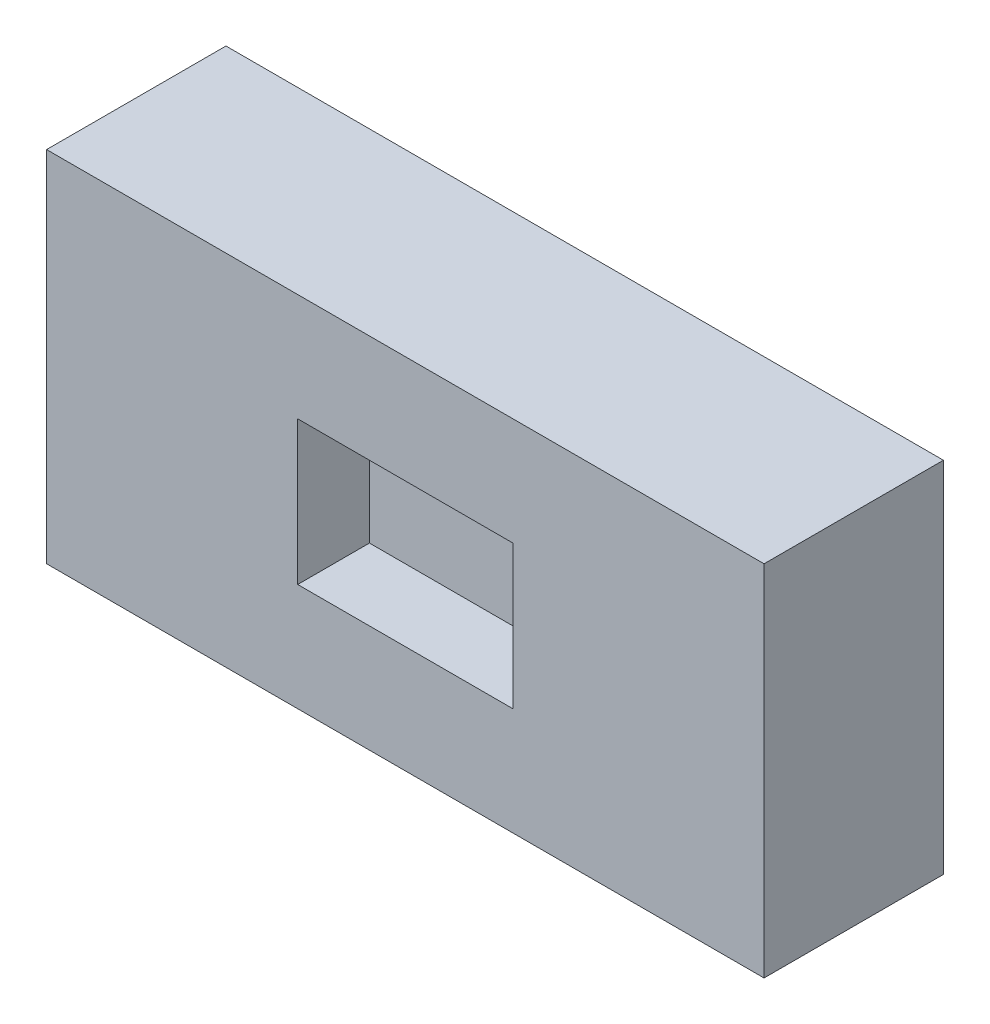
ISO-10303-21;
HEADER;
FILE_DESCRIPTION(('STEP AP214'),'2;1');
FILE_NAME('part.step','',(''),(''),'','','');
FILE_SCHEMA(('AUTOMOTIVE_DESIGN { 1 0 10303 214 1 1 1 1 }'));
ENDSEC;
DATA;
#1=APPLICATION_CONTEXT('core data for automotive mechanical design processes');
#2=APPLICATION_PROTOCOL_DEFINITION('international standard','automotive_design',2000,#1);
#3=PRODUCT_CONTEXT('',#1,'mechanical');
#4=PRODUCT('Part','Part','',(#3));
#5=PRODUCT_RELATED_PRODUCT_CATEGORY('part','',(#4));
#6=PRODUCT_DEFINITION_FORMATION('','',#4);
#7=PRODUCT_DEFINITION_CONTEXT('part definition',#1,'design');
#8=PRODUCT_DEFINITION('design','',#6,#7);
#9=PRODUCT_DEFINITION_SHAPE('','',#8);
#10=(LENGTH_UNIT() NAMED_UNIT(*) SI_UNIT(.MILLI.,.METRE.));
#11=(NAMED_UNIT(*) PLANE_ANGLE_UNIT() SI_UNIT($,.RADIAN.));
#12=(NAMED_UNIT(*) SI_UNIT($,.STERADIAN.) SOLID_ANGLE_UNIT());
#13=UNCERTAINTY_MEASURE_WITH_UNIT(LENGTH_MEASURE(1.E-05),#10,'distance_accuracy_value','');
#14=(GEOMETRIC_REPRESENTATION_CONTEXT(3) GLOBAL_UNCERTAINTY_ASSIGNED_CONTEXT((#13)) GLOBAL_UNIT_ASSIGNED_CONTEXT((#10,
#11,#12)) REPRESENTATION_CONTEXT('',''));
#15=CARTESIAN_POINT('',(0.,0.,0.));
#16=DIRECTION('',(0.,0.,1.));
#17=DIRECTION('',(1.,0.,0.));
#18=AXIS2_PLACEMENT_3D('',#15,#16,#17);
#19=CARTESIAN_POINT('',(0.,0.,10.));
#20=DIRECTION('',(1.,0.,0.));
#21=DIRECTION('',(0.,0.,-1.));
#22=AXIS2_PLACEMENT_3D('',#19,#20,#21);
#23=PLANE('',#22);
#24=DIRECTION('',(0.,-1.,0.));
#25=VECTOR('',#24,1.);
#26=CARTESIAN_POINT('',(0.,0.,0.));
#27=LINE('',#26,#25);
#28=CARTESIAN_POINT('',(0.,20.,0.));
#29=VERTEX_POINT('',#28);
#30=CARTESIAN_POINT('',(0.,0.,0.));
#31=VERTEX_POINT('',#30);
#32=EDGE_CURVE('E153',#29,#31,#27,.T.);
#33=ORIENTED_EDGE('',*,*,#32,.T.);
#34=DIRECTION('',(0.,0.,-1.));
#35=VECTOR('',#34,1.);
#36=CARTESIAN_POINT('',(0.,0.,10.));
#37=LINE('',#36,#35);
#38=CARTESIAN_POINT('',(0.,0.,10.));
#39=VERTEX_POINT('',#38);
#40=EDGE_CURVE('E11',#39,#31,#37,.T.);
#41=ORIENTED_EDGE('',*,*,#40,.F.);
#42=DIRECTION('',(0.,-1.,0.));
#43=VECTOR('',#42,1.);
#44=CARTESIAN_POINT('',(0.,0.,10.));
#45=LINE('',#44,#43);
#46=CARTESIAN_POINT('',(0.,20.,10.));
#47=VERTEX_POINT('',#46);
#48=EDGE_CURVE('E160',#47,#39,#45,.T.);
#49=ORIENTED_EDGE('',*,*,#48,.F.);
#50=DIRECTION('',(0.,0.,-1.));
#51=VECTOR('',#50,1.);
#52=CARTESIAN_POINT('',(0.,20.,10.));
#53=LINE('',#52,#51);
#54=EDGE_CURVE('E162',#47,#29,#53,.T.);
#55=ORIENTED_EDGE('',*,*,#54,.T.);
#56=EDGE_LOOP('',(#33,#41,#49,#55));
#57=FACE_BOUND('',#56,.T.);
#58=ADVANCED_FACE('F44',(#57),#23,.F.);
#59=CARTESIAN_POINT('',(0.,0.,10.));
#60=DIRECTION('',(0.,1.,0.));
#61=DIRECTION('',(0.,0.,1.));
#62=AXIS2_PLACEMENT_3D('',#59,#60,#61);
#63=PLANE('',#62);
#64=DIRECTION('',(1.,0.,0.));
#65=VECTOR('',#64,1.);
#66=CARTESIAN_POINT('',(0.,0.,0.));
#67=LINE('',#66,#65);
#68=CARTESIAN_POINT('',(40.,0.,0.));
#69=VERTEX_POINT('',#68);
#70=EDGE_CURVE('E167',#31,#69,#67,.T.);
#71=ORIENTED_EDGE('',*,*,#70,.T.);
#72=DIRECTION('',(0.,0.,-1.));
#73=VECTOR('',#72,1.);
#74=CARTESIAN_POINT('',(40.,0.,10.));
#75=LINE('',#74,#73);
#76=CARTESIAN_POINT('',(40.,0.,10.));
#77=VERTEX_POINT('',#76);
#78=EDGE_CURVE('E55',#77,#69,#75,.T.);
#79=ORIENTED_EDGE('',*,*,#78,.F.);
#80=DIRECTION('',(1.,0.,0.));
#81=VECTOR('',#80,1.);
#82=CARTESIAN_POINT('',(0.,0.,10.));
#83=LINE('',#82,#81);
#84=EDGE_CURVE('E96',#39,#77,#83,.T.);
#85=ORIENTED_EDGE('',*,*,#84,.F.);
#86=ORIENTED_EDGE('',*,*,#40,.T.);
#87=EDGE_LOOP('',(#71,#79,#85,#86));
#88=FACE_BOUND('',#87,.T.);
#89=ADVANCED_FACE('F198',(#88),#63,.F.);
#90=CARTESIAN_POINT('',(40.,0.,10.));
#91=DIRECTION('',(-1.,0.,0.));
#92=DIRECTION('',(0.,0.,1.));
#93=AXIS2_PLACEMENT_3D('',#90,#91,#92);
#94=PLANE('',#93);
#95=DIRECTION('',(0.,1.,0.));
#96=VECTOR('',#95,1.);
#97=CARTESIAN_POINT('',(40.,0.,0.));
#98=LINE('',#97,#96);
#99=CARTESIAN_POINT('',(40.,20.,0.));
#100=VERTEX_POINT('',#99);
#101=EDGE_CURVE('E169',#69,#100,#98,.T.);
#102=ORIENTED_EDGE('',*,*,#101,.T.);
#103=DIRECTION('',(0.,0.,-1.));
#104=VECTOR('',#103,1.);
#105=CARTESIAN_POINT('',(40.,20.,10.));
#106=LINE('',#105,#104);
#107=CARTESIAN_POINT('',(40.,20.,10.));
#108=VERTEX_POINT('',#107);
#109=EDGE_CURVE('E172',#108,#100,#106,.T.);
#110=ORIENTED_EDGE('',*,*,#109,.F.);
#111=DIRECTION('',(0.,1.,0.));
#112=VECTOR('',#111,1.);
#113=CARTESIAN_POINT('',(40.,0.,10.));
#114=LINE('',#113,#112);
#115=EDGE_CURVE('E159',#77,#108,#114,.T.);
#116=ORIENTED_EDGE('',*,*,#115,.F.);
#117=ORIENTED_EDGE('',*,*,#78,.T.);
#118=EDGE_LOOP('',(#102,#110,#116,#117));
#119=FACE_BOUND('',#118,.T.);
#120=ADVANCED_FACE('F177',(#119),#94,.F.);
#121=CARTESIAN_POINT('',(0.,20.,10.));
#122=DIRECTION('',(0.,-1.,0.));
#123=DIRECTION('',(0.,0.,-1.));
#124=AXIS2_PLACEMENT_3D('',#121,#122,#123);
#125=PLANE('',#124);
#126=DIRECTION('',(-1.,0.,0.));
#127=VECTOR('',#126,1.);
#128=CARTESIAN_POINT('',(0.,20.,0.));
#129=LINE('',#128,#127);
#130=EDGE_CURVE('E90',#100,#29,#129,.T.);
#131=ORIENTED_EDGE('',*,*,#130,.T.);
#132=ORIENTED_EDGE('',*,*,#54,.F.);
#133=DIRECTION('',(-1.,0.,0.));
#134=VECTOR('',#133,1.);
#135=CARTESIAN_POINT('',(0.,20.,10.));
#136=LINE('',#135,#134);
#137=EDGE_CURVE('E69',#108,#47,#136,.T.);
#138=ORIENTED_EDGE('',*,*,#137,.F.);
#139=ORIENTED_EDGE('',*,*,#109,.T.);
#140=EDGE_LOOP('',(#131,#132,#138,#139));
#141=FACE_BOUND('',#140,.T.);
#142=ADVANCED_FACE('F183',(#141),#125,.F.);
#143=CARTESIAN_POINT('',(0.,0.,10.));
#144=DIRECTION('',(0.,0.,-1.));
#145=DIRECTION('',(-1.,0.,0.));
#146=AXIS2_PLACEMENT_3D('',#143,#144,#145);
#147=PLANE('',#146);
#148=DIRECTION('',(1.,0.,0.));
#149=VECTOR('',#148,1.);
#150=CARTESIAN_POINT('',(14.,6.,10.));
#151=LINE('',#150,#149);
#152=CARTESIAN_POINT('',(14.,6.,10.));
#153=VERTEX_POINT('',#152);
#154=CARTESIAN_POINT('',(26.,6.,10.));
#155=VERTEX_POINT('',#154);
#156=EDGE_CURVE('E150',#153,#155,#151,.T.);
#157=ORIENTED_EDGE('',*,*,#156,.F.);
#158=DIRECTION('',(0.,-1.,0.));
#159=VECTOR('',#158,1.);
#160=CARTESIAN_POINT('',(14.,6.,10.));
#161=LINE('',#160,#159);
#162=CARTESIAN_POINT('',(14.,14.,10.));
#163=VERTEX_POINT('',#162);
#164=EDGE_CURVE('E56',#163,#153,#161,.T.);
#165=ORIENTED_EDGE('',*,*,#164,.F.);
#166=DIRECTION('',(-1.,0.,0.));
#167=VECTOR('',#166,1.);
#168=CARTESIAN_POINT('',(14.,14.,10.));
#169=LINE('',#168,#167);
#170=CARTESIAN_POINT('',(26.,14.,10.));
#171=VERTEX_POINT('',#170);
#172=EDGE_CURVE('E139',#171,#163,#169,.T.);
#173=ORIENTED_EDGE('',*,*,#172,.F.);
#174=DIRECTION('',(0.,1.,0.));
#175=VECTOR('',#174,1.);
#176=CARTESIAN_POINT('',(26.,6.,10.));
#177=LINE('',#176,#175);
#178=EDGE_CURVE('E143',#155,#171,#177,.T.);
#179=ORIENTED_EDGE('',*,*,#178,.F.);
#180=EDGE_LOOP('',(#157,#165,#173,#179));
#181=FACE_BOUND('',#180,.T.);
#182=ORIENTED_EDGE('',*,*,#48,.T.);
#183=ORIENTED_EDGE('',*,*,#84,.T.);
#184=ORIENTED_EDGE('',*,*,#115,.T.);
#185=ORIENTED_EDGE('',*,*,#137,.T.);
#186=EDGE_LOOP('',(#182,#183,#184,#185));
#187=FACE_BOUND('',#186,.T.);
#188=ADVANCED_FACE('F187',(#181,#187),#147,.F.);
#189=CARTESIAN_POINT('',(0.,0.,0.));
#190=DIRECTION('',(0.,0.,-1.));
#191=DIRECTION('',(-1.,0.,0.));
#192=AXIS2_PLACEMENT_3D('',#189,#190,#191);
#193=PLANE('',#192);
#194=ORIENTED_EDGE('',*,*,#32,.F.);
#195=ORIENTED_EDGE('',*,*,#130,.F.);
#196=ORIENTED_EDGE('',*,*,#101,.F.);
#197=ORIENTED_EDGE('',*,*,#70,.F.);
#198=EDGE_LOOP('',(#194,#195,#196,#197));
#199=FACE_BOUND('',#198,.T.);
#200=ADVANCED_FACE('F182',(#199),#193,.T.);
#201=CARTESIAN_POINT('',(14.,6.,6.));
#202=DIRECTION('',(-1.,0.,0.));
#203=DIRECTION('',(0.,0.,1.));
#204=AXIS2_PLACEMENT_3D('',#201,#202,#203);
#205=PLANE('',#204);
#206=ORIENTED_EDGE('',*,*,#164,.T.);
#207=DIRECTION('',(0.,0.,1.));
#208=VECTOR('',#207,1.);
#209=CARTESIAN_POINT('',(14.,6.,6.));
#210=LINE('',#209,#208);
#211=CARTESIAN_POINT('',(14.,6.,6.));
#212=VERTEX_POINT('',#211);
#213=EDGE_CURVE('E116',#212,#153,#210,.T.);
#214=ORIENTED_EDGE('',*,*,#213,.F.);
#215=DIRECTION('',(0.,-1.,0.));
#216=VECTOR('',#215,1.);
#217=CARTESIAN_POINT('',(14.,6.,6.));
#218=LINE('',#217,#216);
#219=CARTESIAN_POINT('',(14.,14.,6.));
#220=VERTEX_POINT('',#219);
#221=EDGE_CURVE('E120',#220,#212,#218,.T.);
#222=ORIENTED_EDGE('',*,*,#221,.F.);
#223=DIRECTION('',(0.,0.,1.));
#224=VECTOR('',#223,1.);
#225=CARTESIAN_POINT('',(14.,14.,6.));
#226=LINE('',#225,#224);
#227=EDGE_CURVE('E151',#220,#163,#226,.T.);
#228=ORIENTED_EDGE('',*,*,#227,.T.);
#229=EDGE_LOOP('',(#206,#214,#222,#228));
#230=FACE_BOUND('',#229,.T.);
#231=ADVANCED_FACE('F119',(#230),#205,.F.);
#232=CARTESIAN_POINT('',(14.,14.,6.));
#233=DIRECTION('',(0.,1.,0.));
#234=DIRECTION('',(0.,0.,1.));
#235=AXIS2_PLACEMENT_3D('',#232,#233,#234);
#236=PLANE('',#235);
#237=ORIENTED_EDGE('',*,*,#172,.T.);
#238=ORIENTED_EDGE('',*,*,#227,.F.);
#239=DIRECTION('',(-1.,0.,0.));
#240=VECTOR('',#239,1.);
#241=CARTESIAN_POINT('',(14.,14.,6.));
#242=LINE('',#241,#240);
#243=CARTESIAN_POINT('',(26.,14.,6.));
#244=VERTEX_POINT('',#243);
#245=EDGE_CURVE('E127',#244,#220,#242,.T.);
#246=ORIENTED_EDGE('',*,*,#245,.F.);
#247=DIRECTION('',(0.,0.,1.));
#248=VECTOR('',#247,1.);
#249=CARTESIAN_POINT('',(26.,14.,6.));
#250=LINE('',#249,#248);
#251=EDGE_CURVE('E152',#244,#171,#250,.T.);
#252=ORIENTED_EDGE('',*,*,#251,.T.);
#253=EDGE_LOOP('',(#237,#238,#246,#252));
#254=FACE_BOUND('',#253,.T.);
#255=ADVANCED_FACE('F240',(#254),#236,.F.);
#256=CARTESIAN_POINT('',(26.,6.,6.));
#257=DIRECTION('',(1.,0.,0.));
#258=DIRECTION('',(0.,0.,-1.));
#259=AXIS2_PLACEMENT_3D('',#256,#257,#258);
#260=PLANE('',#259);
#261=ORIENTED_EDGE('',*,*,#178,.T.);
#262=ORIENTED_EDGE('',*,*,#251,.F.);
#263=DIRECTION('',(0.,1.,0.));
#264=VECTOR('',#263,1.);
#265=CARTESIAN_POINT('',(26.,6.,6.));
#266=LINE('',#265,#264);
#267=CARTESIAN_POINT('',(26.,6.,6.));
#268=VERTEX_POINT('',#267);
#269=EDGE_CURVE('E133',#268,#244,#266,.T.);
#270=ORIENTED_EDGE('',*,*,#269,.F.);
#271=DIRECTION('',(0.,0.,1.));
#272=VECTOR('',#271,1.);
#273=CARTESIAN_POINT('',(26.,6.,6.));
#274=LINE('',#273,#272);
#275=EDGE_CURVE('E125',#268,#155,#274,.T.);
#276=ORIENTED_EDGE('',*,*,#275,.T.);
#277=EDGE_LOOP('',(#261,#262,#270,#276));
#278=FACE_BOUND('',#277,.T.);
#279=ADVANCED_FACE('F246',(#278),#260,.F.);
#280=CARTESIAN_POINT('',(14.,6.,6.));
#281=DIRECTION('',(0.,-1.,0.));
#282=DIRECTION('',(0.,0.,-1.));
#283=AXIS2_PLACEMENT_3D('',#280,#281,#282);
#284=PLANE('',#283);
#285=ORIENTED_EDGE('',*,*,#156,.T.);
#286=ORIENTED_EDGE('',*,*,#275,.F.);
#287=DIRECTION('',(1.,0.,0.));
#288=VECTOR('',#287,1.);
#289=CARTESIAN_POINT('',(14.,6.,6.));
#290=LINE('',#289,#288);
#291=EDGE_CURVE('E129',#212,#268,#290,.T.);
#292=ORIENTED_EDGE('',*,*,#291,.F.);
#293=ORIENTED_EDGE('',*,*,#213,.T.);
#294=EDGE_LOOP('',(#285,#286,#292,#293));
#295=FACE_BOUND('',#294,.T.);
#296=ADVANCED_FACE('F128',(#295),#284,.F.);
#297=CARTESIAN_POINT('',(0.,0.,6.));
#298=DIRECTION('',(0.,0.,-1.));
#299=DIRECTION('',(-1.,0.,0.));
#300=AXIS2_PLACEMENT_3D('',#297,#298,#299);
#301=PLANE('',#300);
#302=ORIENTED_EDGE('',*,*,#221,.T.);
#303=ORIENTED_EDGE('',*,*,#291,.T.);
#304=ORIENTED_EDGE('',*,*,#269,.T.);
#305=ORIENTED_EDGE('',*,*,#245,.T.);
#306=EDGE_LOOP('',(#302,#303,#304,#305));
#307=FACE_BOUND('',#306,.T.);
#308=ADVANCED_FACE('F136',(#307),#301,.F.);
#309=CLOSED_SHELL('',(#58,#89,#120,#142,#188,#200,#231,#255,#279,#296,#308));
#310=MANIFOLD_SOLID_BREP('B2',#309);
#311=ADVANCED_BREP_SHAPE_REPRESENTATION('',(#18,#310),#14);
#312=SHAPE_DEFINITION_REPRESENTATION(#9,#311);
ENDSEC;
END-ISO-10303-21;
